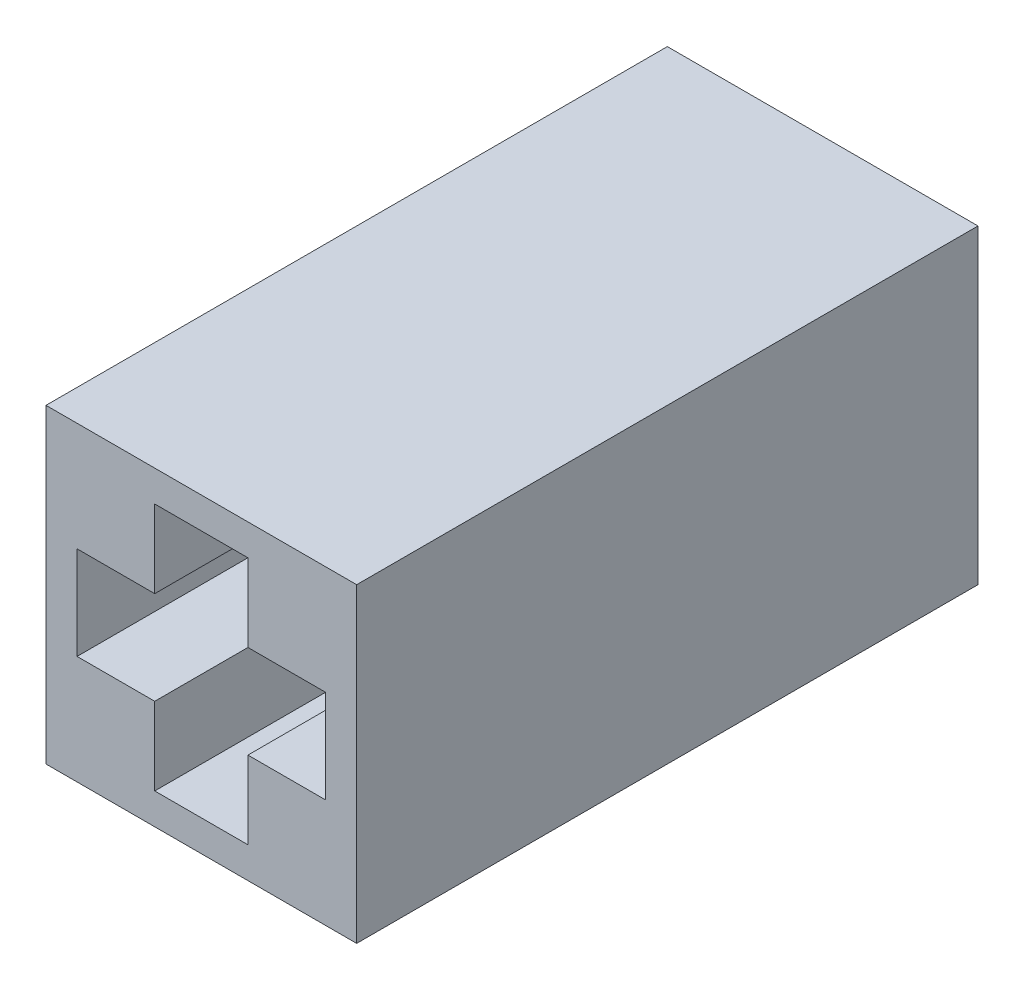
ISO-10303-21;
HEADER;
FILE_DESCRIPTION(('STEP AP214'),'2;1');
FILE_NAME('part.step','',(''),(''),'','','');
FILE_SCHEMA(('AUTOMOTIVE_DESIGN { 1 0 10303 214 1 1 1 1 }'));
ENDSEC;
DATA;
#1=APPLICATION_CONTEXT('core data for automotive mechanical design processes');
#2=APPLICATION_PROTOCOL_DEFINITION('international standard','automotive_design',2000,#1);
#3=PRODUCT_CONTEXT('',#1,'mechanical');
#4=PRODUCT('Part','Part','',(#3));
#5=PRODUCT_RELATED_PRODUCT_CATEGORY('part','',(#4));
#6=PRODUCT_DEFINITION_FORMATION('','',#4);
#7=PRODUCT_DEFINITION_CONTEXT('part definition',#1,'design');
#8=PRODUCT_DEFINITION('design','',#6,#7);
#9=PRODUCT_DEFINITION_SHAPE('','',#8);
#10=(LENGTH_UNIT() NAMED_UNIT(*) SI_UNIT(.MILLI.,.METRE.));
#11=(NAMED_UNIT(*) PLANE_ANGLE_UNIT() SI_UNIT($,.RADIAN.));
#12=(NAMED_UNIT(*) SI_UNIT($,.STERADIAN.) SOLID_ANGLE_UNIT());
#13=UNCERTAINTY_MEASURE_WITH_UNIT(LENGTH_MEASURE(1.E-05),#10,'distance_accuracy_value','');
#14=(GEOMETRIC_REPRESENTATION_CONTEXT(3) GLOBAL_UNCERTAINTY_ASSIGNED_CONTEXT((#13)) GLOBAL_UNIT_ASSIGNED_CONTEXT((#10,
#11,#12)) REPRESENTATION_CONTEXT('',''));
#15=CARTESIAN_POINT('',(0.,0.,0.));
#16=DIRECTION('',(0.,0.,1.));
#17=DIRECTION('',(1.,0.,0.));
#18=AXIS2_PLACEMENT_3D('',#15,#16,#17);
#19=CARTESIAN_POINT('',(25.,25.,-100.));
#20=DIRECTION('',(1.,0.,0.));
#21=DIRECTION('',(0.,1.,0.));
#22=AXIS2_PLACEMENT_3D('',#19,#20,#21);
#23=PLANE('',#22);
#24=DIRECTION('',(0.,1.,0.));
#25=VECTOR('',#24,1.);
#26=CARTESIAN_POINT('',(25.,25.,0.));
#27=LINE('',#26,#25);
#28=CARTESIAN_POINT('',(25.,-25.,0.));
#29=VERTEX_POINT('',#28);
#30=CARTESIAN_POINT('',(25.,25.,0.));
#31=VERTEX_POINT('',#30);
#32=EDGE_CURVE('E248',#29,#31,#27,.T.);
#33=ORIENTED_EDGE('',*,*,#32,.F.);
#34=DIRECTION('',(0.,0.,1.));
#35=VECTOR('',#34,1.);
#36=CARTESIAN_POINT('',(25.,-25.,-100.));
#37=LINE('',#36,#35);
#38=CARTESIAN_POINT('',(25.,-25.,-100.));
#39=VERTEX_POINT('',#38);
#40=EDGE_CURVE('E11',#39,#29,#37,.T.);
#41=ORIENTED_EDGE('',*,*,#40,.F.);
#42=DIRECTION('',(0.,1.,0.));
#43=VECTOR('',#42,1.);
#44=CARTESIAN_POINT('',(25.,25.,-100.));
#45=LINE('',#44,#43);
#46=CARTESIAN_POINT('',(25.,25.,-100.));
#47=VERTEX_POINT('',#46);
#48=EDGE_CURVE('E249',#39,#47,#45,.T.);
#49=ORIENTED_EDGE('',*,*,#48,.T.);
#50=DIRECTION('',(0.,0.,1.));
#51=VECTOR('',#50,1.);
#52=CARTESIAN_POINT('',(25.,25.,-100.));
#53=LINE('',#52,#51);
#54=EDGE_CURVE('E36',#47,#31,#53,.T.);
#55=ORIENTED_EDGE('',*,*,#54,.T.);
#56=EDGE_LOOP('',(#33,#41,#49,#55));
#57=FACE_BOUND('',#56,.T.);
#58=ADVANCED_FACE('F33',(#57),#23,.T.);
#59=CARTESIAN_POINT('',(-25.,-25.,-100.));
#60=DIRECTION('',(0.,-1.,0.));
#61=DIRECTION('',(0.,0.,-1.));
#62=AXIS2_PLACEMENT_3D('',#59,#60,#61);
#63=PLANE('',#62);
#64=DIRECTION('',(1.,0.,0.));
#65=VECTOR('',#64,1.);
#66=CARTESIAN_POINT('',(-25.,-25.,0.));
#67=LINE('',#66,#65);
#68=CARTESIAN_POINT('',(-25.,-25.,0.));
#69=VERTEX_POINT('',#68);
#70=EDGE_CURVE('E253',#69,#29,#67,.T.);
#71=ORIENTED_EDGE('',*,*,#70,.F.);
#72=DIRECTION('',(0.,0.,1.));
#73=VECTOR('',#72,1.);
#74=CARTESIAN_POINT('',(-25.,-25.,-100.));
#75=LINE('',#74,#73);
#76=CARTESIAN_POINT('',(-25.,-25.,-100.));
#77=VERTEX_POINT('',#76);
#78=EDGE_CURVE('E41',#77,#69,#75,.T.);
#79=ORIENTED_EDGE('',*,*,#78,.F.);
#80=DIRECTION('',(1.,0.,0.));
#81=VECTOR('',#80,1.);
#82=CARTESIAN_POINT('',(-25.,-25.,-100.));
#83=LINE('',#82,#81);
#84=EDGE_CURVE('E259',#77,#39,#83,.T.);
#85=ORIENTED_EDGE('',*,*,#84,.T.);
#86=ORIENTED_EDGE('',*,*,#40,.T.);
#87=EDGE_LOOP('',(#71,#79,#85,#86));
#88=FACE_BOUND('',#87,.T.);
#89=ADVANCED_FACE('F283',(#88),#63,.T.);
#90=CARTESIAN_POINT('',(-25.,25.,-100.));
#91=DIRECTION('',(-1.,0.,0.));
#92=DIRECTION('',(0.,-1.,0.));
#93=AXIS2_PLACEMENT_3D('',#90,#91,#92);
#94=PLANE('',#93);
#95=DIRECTION('',(0.,-1.,0.));
#96=VECTOR('',#95,1.);
#97=CARTESIAN_POINT('',(-25.,25.,0.));
#98=LINE('',#97,#96);
#99=CARTESIAN_POINT('',(-25.,25.,0.));
#100=VERTEX_POINT('',#99);
#101=EDGE_CURVE('E267',#100,#69,#98,.T.);
#102=ORIENTED_EDGE('',*,*,#101,.F.);
#103=DIRECTION('',(0.,0.,1.));
#104=VECTOR('',#103,1.);
#105=CARTESIAN_POINT('',(-25.,25.,-100.));
#106=LINE('',#105,#104);
#107=CARTESIAN_POINT('',(-25.,25.,-100.));
#108=VERTEX_POINT('',#107);
#109=EDGE_CURVE('E272',#108,#100,#106,.T.);
#110=ORIENTED_EDGE('',*,*,#109,.F.);
#111=DIRECTION('',(0.,-1.,0.));
#112=VECTOR('',#111,1.);
#113=CARTESIAN_POINT('',(-25.,25.,-100.));
#114=LINE('',#113,#112);
#115=EDGE_CURVE('E256',#108,#77,#114,.T.);
#116=ORIENTED_EDGE('',*,*,#115,.T.);
#117=ORIENTED_EDGE('',*,*,#78,.T.);
#118=EDGE_LOOP('',(#102,#110,#116,#117));
#119=FACE_BOUND('',#118,.T.);
#120=ADVANCED_FACE('F289',(#119),#94,.T.);
#121=CARTESIAN_POINT('',(-25.,25.,-100.));
#122=DIRECTION('',(0.,1.,0.));
#123=DIRECTION('',(0.,0.,1.));
#124=AXIS2_PLACEMENT_3D('',#121,#122,#123);
#125=PLANE('',#124);
#126=DIRECTION('',(-1.,0.,0.));
#127=VECTOR('',#126,1.);
#128=CARTESIAN_POINT('',(-25.,25.,0.));
#129=LINE('',#128,#127);
#130=EDGE_CURVE('E264',#31,#100,#129,.T.);
#131=ORIENTED_EDGE('',*,*,#130,.F.);
#132=ORIENTED_EDGE('',*,*,#54,.F.);
#133=DIRECTION('',(-1.,0.,0.));
#134=VECTOR('',#133,1.);
#135=CARTESIAN_POINT('',(-25.,25.,-100.));
#136=LINE('',#135,#134);
#137=EDGE_CURVE('E252',#47,#108,#136,.T.);
#138=ORIENTED_EDGE('',*,*,#137,.T.);
#139=ORIENTED_EDGE('',*,*,#109,.T.);
#140=EDGE_LOOP('',(#131,#132,#138,#139));
#141=FACE_BOUND('',#140,.T.);
#142=ADVANCED_FACE('F280',(#141),#125,.T.);
#143=CARTESIAN_POINT('',(0.,0.,-100.));
#144=DIRECTION('',(0.,0.,1.));
#145=DIRECTION('',(1.,0.,0.));
#146=AXIS2_PLACEMENT_3D('',#143,#144,#145);
#147=PLANE('',#146);
#148=DIRECTION('',(1.,0.,0.));
#149=VECTOR('',#148,1.);
#150=CARTESIAN_POINT('',(0.,-20.,-100.));
#151=LINE('',#150,#149);
#152=CARTESIAN_POINT('',(-7.5,-20.,-100.));
#153=VERTEX_POINT('',#152);
#154=CARTESIAN_POINT('',(7.5,-20.,-100.));
#155=VERTEX_POINT('',#154);
#156=EDGE_CURVE('E242',#153,#155,#151,.T.);
#157=ORIENTED_EDGE('',*,*,#156,.T.);
#158=DIRECTION('',(0.,1.,0.));
#159=VECTOR('',#158,1.);
#160=CARTESIAN_POINT('',(7.5,0.,-100.));
#161=LINE('',#160,#159);
#162=CARTESIAN_POINT('',(7.5,-7.5,-100.));
#163=VERTEX_POINT('',#162);
#164=EDGE_CURVE('E245',#155,#163,#161,.T.);
#165=ORIENTED_EDGE('',*,*,#164,.T.);
#166=DIRECTION('',(1.,0.,0.));
#167=VECTOR('',#166,1.);
#168=CARTESIAN_POINT('',(0.,-7.5,-100.));
#169=LINE('',#168,#167);
#170=CARTESIAN_POINT('',(20.,-7.5,-100.));
#171=VERTEX_POINT('',#170);
#172=EDGE_CURVE('E197',#163,#171,#169,.T.);
#173=ORIENTED_EDGE('',*,*,#172,.T.);
#174=DIRECTION('',(0.,1.,0.));
#175=VECTOR('',#174,1.);
#176=CARTESIAN_POINT('',(20.,0.,-100.));
#177=LINE('',#176,#175);
#178=CARTESIAN_POINT('',(20.,7.5,-100.));
#179=VERTEX_POINT('',#178);
#180=EDGE_CURVE('E152',#171,#179,#177,.T.);
#181=ORIENTED_EDGE('',*,*,#180,.T.);
#182=DIRECTION('',(-1.,0.,0.));
#183=VECTOR('',#182,1.);
#184=CARTESIAN_POINT('',(0.,7.5,-100.));
#185=LINE('',#184,#183);
#186=CARTESIAN_POINT('',(7.5,7.5,-100.));
#187=VERTEX_POINT('',#186);
#188=EDGE_CURVE('E218',#179,#187,#185,.T.);
#189=ORIENTED_EDGE('',*,*,#188,.T.);
#190=DIRECTION('',(0.,1.,0.));
#191=VECTOR('',#190,1.);
#192=CARTESIAN_POINT('',(7.5,0.,-100.));
#193=LINE('',#192,#191);
#194=CARTESIAN_POINT('',(7.5,20.,-100.));
#195=VERTEX_POINT('',#194);
#196=EDGE_CURVE('E221',#187,#195,#193,.T.);
#197=ORIENTED_EDGE('',*,*,#196,.T.);
#198=DIRECTION('',(-1.,0.,0.));
#199=VECTOR('',#198,1.);
#200=CARTESIAN_POINT('',(0.,20.,-100.));
#201=LINE('',#200,#199);
#202=CARTESIAN_POINT('',(-7.5,20.,-100.));
#203=VERTEX_POINT('',#202);
#204=EDGE_CURVE('E224',#195,#203,#201,.T.);
#205=ORIENTED_EDGE('',*,*,#204,.T.);
#206=DIRECTION('',(0.,-1.,0.));
#207=VECTOR('',#206,1.);
#208=CARTESIAN_POINT('',(-7.5,0.,-100.));
#209=LINE('',#208,#207);
#210=CARTESIAN_POINT('',(-7.5,7.5,-100.));
#211=VERTEX_POINT('',#210);
#212=EDGE_CURVE('E227',#203,#211,#209,.T.);
#213=ORIENTED_EDGE('',*,*,#212,.T.);
#214=DIRECTION('',(-1.,0.,0.));
#215=VECTOR('',#214,1.);
#216=CARTESIAN_POINT('',(0.,7.5,-100.));
#217=LINE('',#216,#215);
#218=CARTESIAN_POINT('',(-20.,7.5,-100.));
#219=VERTEX_POINT('',#218);
#220=EDGE_CURVE('E230',#211,#219,#217,.T.);
#221=ORIENTED_EDGE('',*,*,#220,.T.);
#222=DIRECTION('',(0.,-1.,0.));
#223=VECTOR('',#222,1.);
#224=CARTESIAN_POINT('',(-20.,0.,-100.));
#225=LINE('',#224,#223);
#226=CARTESIAN_POINT('',(-20.,-7.5,-100.));
#227=VERTEX_POINT('',#226);
#228=EDGE_CURVE('E233',#219,#227,#225,.T.);
#229=ORIENTED_EDGE('',*,*,#228,.T.);
#230=DIRECTION('',(1.,0.,0.));
#231=VECTOR('',#230,1.);
#232=CARTESIAN_POINT('',(0.,-7.5,-100.));
#233=LINE('',#232,#231);
#234=CARTESIAN_POINT('',(-7.5,-7.5,-100.));
#235=VERTEX_POINT('',#234);
#236=EDGE_CURVE('E236',#227,#235,#233,.T.);
#237=ORIENTED_EDGE('',*,*,#236,.T.);
#238=DIRECTION('',(0.,-1.,0.));
#239=VECTOR('',#238,1.);
#240=CARTESIAN_POINT('',(-7.5,0.,-100.));
#241=LINE('',#240,#239);
#242=EDGE_CURVE('E239',#235,#153,#241,.T.);
#243=ORIENTED_EDGE('',*,*,#242,.T.);
#244=EDGE_LOOP('',(#157,#165,#173,#181,#189,#197,#205,#213,#221,#229,#237,#243));
#245=FACE_BOUND('',#244,.T.);
#246=ORIENTED_EDGE('',*,*,#48,.F.);
#247=ORIENTED_EDGE('',*,*,#84,.F.);
#248=ORIENTED_EDGE('',*,*,#115,.F.);
#249=ORIENTED_EDGE('',*,*,#137,.F.);
#250=EDGE_LOOP('',(#246,#247,#248,#249));
#251=FACE_BOUND('',#250,.T.);
#252=ADVANCED_FACE('F286',(#245,#251),#147,.F.);
#253=CARTESIAN_POINT('',(0.,0.,0.));
#254=DIRECTION('',(0.,0.,1.));
#255=DIRECTION('',(1.,0.,0.));
#256=AXIS2_PLACEMENT_3D('',#253,#254,#255);
#257=PLANE('',#256);
#258=DIRECTION('',(0.,1.,0.));
#259=VECTOR('',#258,1.);
#260=CARTESIAN_POINT('',(7.5,-7.5,0.));
#261=LINE('',#260,#259);
#262=CARTESIAN_POINT('',(7.5,-20.,0.));
#263=VERTEX_POINT('',#262);
#264=CARTESIAN_POINT('',(7.5,-7.5,0.));
#265=VERTEX_POINT('',#264);
#266=EDGE_CURVE('E57',#263,#265,#261,.T.);
#267=ORIENTED_EDGE('',*,*,#266,.F.);
#268=DIRECTION('',(1.,0.,0.));
#269=VECTOR('',#268,1.);
#270=CARTESIAN_POINT('',(-7.5,-20.,0.));
#271=LINE('',#270,#269);
#272=CARTESIAN_POINT('',(-7.5,-20.,0.));
#273=VERTEX_POINT('',#272);
#274=EDGE_CURVE('E192',#273,#263,#271,.T.);
#275=ORIENTED_EDGE('',*,*,#274,.F.);
#276=DIRECTION('',(0.,-1.,0.));
#277=VECTOR('',#276,1.);
#278=CARTESIAN_POINT('',(-7.5,-7.5,0.));
#279=LINE('',#278,#277);
#280=CARTESIAN_POINT('',(-7.5,-7.5,0.));
#281=VERTEX_POINT('',#280);
#282=EDGE_CURVE('E189',#281,#273,#279,.T.);
#283=ORIENTED_EDGE('',*,*,#282,.F.);
#284=DIRECTION('',(1.,0.,0.));
#285=VECTOR('',#284,1.);
#286=CARTESIAN_POINT('',(-20.,-7.5,0.));
#287=LINE('',#286,#285);
#288=CARTESIAN_POINT('',(-20.,-7.5,0.));
#289=VERTEX_POINT('',#288);
#290=EDGE_CURVE('E186',#289,#281,#287,.T.);
#291=ORIENTED_EDGE('',*,*,#290,.F.);
#292=DIRECTION('',(0.,-1.,0.));
#293=VECTOR('',#292,1.);
#294=CARTESIAN_POINT('',(-20.,7.5,0.));
#295=LINE('',#294,#293);
#296=CARTESIAN_POINT('',(-20.,7.5,0.));
#297=VERTEX_POINT('',#296);
#298=EDGE_CURVE('E183',#297,#289,#295,.T.);
#299=ORIENTED_EDGE('',*,*,#298,.F.);
#300=DIRECTION('',(-1.,0.,0.));
#301=VECTOR('',#300,1.);
#302=CARTESIAN_POINT('',(-20.,7.5,0.));
#303=LINE('',#302,#301);
#304=CARTESIAN_POINT('',(-7.5,7.5,0.));
#305=VERTEX_POINT('',#304);
#306=EDGE_CURVE('E180',#305,#297,#303,.T.);
#307=ORIENTED_EDGE('',*,*,#306,.F.);
#308=DIRECTION('',(0.,-1.,0.));
#309=VECTOR('',#308,1.);
#310=CARTESIAN_POINT('',(-7.5,20.,0.));
#311=LINE('',#310,#309);
#312=CARTESIAN_POINT('',(-7.5,20.,0.));
#313=VERTEX_POINT('',#312);
#314=EDGE_CURVE('E177',#313,#305,#311,.T.);
#315=ORIENTED_EDGE('',*,*,#314,.F.);
#316=DIRECTION('',(-1.,0.,0.));
#317=VECTOR('',#316,1.);
#318=CARTESIAN_POINT('',(-7.5,20.,0.));
#319=LINE('',#318,#317);
#320=CARTESIAN_POINT('',(7.5,20.,0.));
#321=VERTEX_POINT('',#320);
#322=EDGE_CURVE('E174',#321,#313,#319,.T.);
#323=ORIENTED_EDGE('',*,*,#322,.F.);
#324=DIRECTION('',(0.,1.,0.));
#325=VECTOR('',#324,1.);
#326=CARTESIAN_POINT('',(7.5,20.,0.));
#327=LINE('',#326,#325);
#328=CARTESIAN_POINT('',(7.5,7.5,0.));
#329=VERTEX_POINT('',#328);
#330=EDGE_CURVE('E168',#329,#321,#327,.T.);
#331=ORIENTED_EDGE('',*,*,#330,.F.);
#332=DIRECTION('',(-1.,0.,0.));
#333=VECTOR('',#332,1.);
#334=CARTESIAN_POINT('',(7.5,7.5,0.));
#335=LINE('',#334,#333);
#336=CARTESIAN_POINT('',(20.,7.5,0.));
#337=VERTEX_POINT('',#336);
#338=EDGE_CURVE('E166',#337,#329,#335,.T.);
#339=ORIENTED_EDGE('',*,*,#338,.F.);
#340=DIRECTION('',(0.,1.,0.));
#341=VECTOR('',#340,1.);
#342=CARTESIAN_POINT('',(20.,7.5,0.));
#343=LINE('',#342,#341);
#344=CARTESIAN_POINT('',(20.,-7.5,0.));
#345=VERTEX_POINT('',#344);
#346=EDGE_CURVE('E149',#345,#337,#343,.T.);
#347=ORIENTED_EDGE('',*,*,#346,.F.);
#348=DIRECTION('',(1.,0.,0.));
#349=VECTOR('',#348,1.);
#350=CARTESIAN_POINT('',(7.5,-7.5,0.));
#351=LINE('',#350,#349);
#352=EDGE_CURVE('E158',#265,#345,#351,.T.);
#353=ORIENTED_EDGE('',*,*,#352,.F.);
#354=EDGE_LOOP('',(#267,#275,#283,#291,#299,#307,#315,#323,#331,#339,#347,#353));
#355=FACE_BOUND('',#354,.T.);
#356=ORIENTED_EDGE('',*,*,#32,.T.);
#357=ORIENTED_EDGE('',*,*,#130,.T.);
#358=ORIENTED_EDGE('',*,*,#101,.T.);
#359=ORIENTED_EDGE('',*,*,#70,.T.);
#360=EDGE_LOOP('',(#356,#357,#358,#359));
#361=FACE_BOUND('',#360,.T.);
#362=ADVANCED_FACE('F162',(#355,#361),#257,.T.);
#363=CARTESIAN_POINT('',(7.5,-7.5,-400.));
#364=DIRECTION('',(1.,0.,0.));
#365=DIRECTION('',(0.,1.,0.));
#366=AXIS2_PLACEMENT_3D('',#363,#364,#365);
#367=PLANE('',#366);
#368=DIRECTION('',(0.,0.,1.));
#369=VECTOR('',#368,1.);
#370=CARTESIAN_POINT('',(7.5,-20.,-400.));
#371=LINE('',#370,#369);
#372=EDGE_CURVE('E195',#155,#263,#371,.T.);
#373=ORIENTED_EDGE('',*,*,#372,.T.);
#374=ORIENTED_EDGE('',*,*,#266,.T.);
#375=DIRECTION('',(0.,0.,1.));
#376=VECTOR('',#375,1.);
#377=CARTESIAN_POINT('',(7.5,-7.5,-400.));
#378=LINE('',#377,#376);
#379=EDGE_CURVE('E155',#163,#265,#378,.T.);
#380=ORIENTED_EDGE('',*,*,#379,.F.);
#381=ORIENTED_EDGE('',*,*,#164,.F.);
#382=EDGE_LOOP('',(#373,#374,#380,#381));
#383=FACE_BOUND('',#382,.T.);
#384=ADVANCED_FACE('F332',(#383),#367,.F.);
#385=CARTESIAN_POINT('',(-7.5,-20.,-400.));
#386=DIRECTION('',(0.,-1.,0.));
#387=DIRECTION('',(0.,0.,-1.));
#388=AXIS2_PLACEMENT_3D('',#385,#386,#387);
#389=PLANE('',#388);
#390=DIRECTION('',(0.,0.,1.));
#391=VECTOR('',#390,1.);
#392=CARTESIAN_POINT('',(-7.5,-20.,-400.));
#393=LINE('',#392,#391);
#394=EDGE_CURVE('E198',#153,#273,#393,.T.);
#395=ORIENTED_EDGE('',*,*,#394,.T.);
#396=ORIENTED_EDGE('',*,*,#274,.T.);
#397=ORIENTED_EDGE('',*,*,#372,.F.);
#398=ORIENTED_EDGE('',*,*,#156,.F.);
#399=EDGE_LOOP('',(#395,#396,#397,#398));
#400=FACE_BOUND('',#399,.T.);
#401=ADVANCED_FACE('F341',(#400),#389,.F.);
#402=CARTESIAN_POINT('',(-7.5,-7.5,-400.));
#403=DIRECTION('',(-1.,0.,0.));
#404=DIRECTION('',(0.,0.,1.));
#405=AXIS2_PLACEMENT_3D('',#402,#403,#404);
#406=PLANE('',#405);
#407=DIRECTION('',(0.,0.,1.));
#408=VECTOR('',#407,1.);
#409=CARTESIAN_POINT('',(-7.5,-7.5,-400.));
#410=LINE('',#409,#408);
#411=EDGE_CURVE('E200',#235,#281,#410,.T.);
#412=ORIENTED_EDGE('',*,*,#411,.T.);
#413=ORIENTED_EDGE('',*,*,#282,.T.);
#414=ORIENTED_EDGE('',*,*,#394,.F.);
#415=ORIENTED_EDGE('',*,*,#242,.F.);
#416=EDGE_LOOP('',(#412,#413,#414,#415));
#417=FACE_BOUND('',#416,.T.);
#418=ADVANCED_FACE('F350',(#417),#406,.F.);
#419=CARTESIAN_POINT('',(-20.,-7.5,-400.));
#420=DIRECTION('',(0.,-1.,0.));
#421=DIRECTION('',(1.,0.,0.));
#422=AXIS2_PLACEMENT_3D('',#419,#420,#421);
#423=PLANE('',#422);
#424=DIRECTION('',(0.,0.,1.));
#425=VECTOR('',#424,1.);
#426=CARTESIAN_POINT('',(-20.,-7.5,-400.));
#427=LINE('',#426,#425);
#428=EDGE_CURVE('E202',#227,#289,#427,.T.);
#429=ORIENTED_EDGE('',*,*,#428,.T.);
#430=ORIENTED_EDGE('',*,*,#290,.T.);
#431=ORIENTED_EDGE('',*,*,#411,.F.);
#432=ORIENTED_EDGE('',*,*,#236,.F.);
#433=EDGE_LOOP('',(#429,#430,#431,#432));
#434=FACE_BOUND('',#433,.T.);
#435=ADVANCED_FACE('F360',(#434),#423,.F.);
#436=CARTESIAN_POINT('',(-20.,7.5,-400.));
#437=DIRECTION('',(-1.,0.,0.));
#438=DIRECTION('',(0.,-1.,0.));
#439=AXIS2_PLACEMENT_3D('',#436,#437,#438);
#440=PLANE('',#439);
#441=DIRECTION('',(0.,0.,1.));
#442=VECTOR('',#441,1.);
#443=CARTESIAN_POINT('',(-20.,7.5,-400.));
#444=LINE('',#443,#442);
#445=EDGE_CURVE('E204',#219,#297,#444,.T.);
#446=ORIENTED_EDGE('',*,*,#445,.T.);
#447=ORIENTED_EDGE('',*,*,#298,.T.);
#448=ORIENTED_EDGE('',*,*,#428,.F.);
#449=ORIENTED_EDGE('',*,*,#228,.F.);
#450=EDGE_LOOP('',(#446,#447,#448,#449));
#451=FACE_BOUND('',#450,.T.);
#452=ADVANCED_FACE('F370',(#451),#440,.F.);
#453=CARTESIAN_POINT('',(-20.,7.5,-400.));
#454=DIRECTION('',(0.,1.,0.));
#455=DIRECTION('',(-1.,0.,0.));
#456=AXIS2_PLACEMENT_3D('',#453,#454,#455);
#457=PLANE('',#456);
#458=DIRECTION('',(0.,0.,1.));
#459=VECTOR('',#458,1.);
#460=CARTESIAN_POINT('',(-7.5,7.5,-400.));
#461=LINE('',#460,#459);
#462=EDGE_CURVE('E206',#211,#305,#461,.T.);
#463=ORIENTED_EDGE('',*,*,#462,.T.);
#464=ORIENTED_EDGE('',*,*,#306,.T.);
#465=ORIENTED_EDGE('',*,*,#445,.F.);
#466=ORIENTED_EDGE('',*,*,#220,.F.);
#467=EDGE_LOOP('',(#463,#464,#465,#466));
#468=FACE_BOUND('',#467,.T.);
#469=ADVANCED_FACE('F380',(#468),#457,.F.);
#470=CARTESIAN_POINT('',(-7.5,20.,-400.));
#471=DIRECTION('',(-1.,0.,0.));
#472=DIRECTION('',(0.,-1.,0.));
#473=AXIS2_PLACEMENT_3D('',#470,#471,#472);
#474=PLANE('',#473);
#475=DIRECTION('',(0.,0.,1.));
#476=VECTOR('',#475,1.);
#477=CARTESIAN_POINT('',(-7.5,20.,-400.));
#478=LINE('',#477,#476);
#479=EDGE_CURVE('E208',#203,#313,#478,.T.);
#480=ORIENTED_EDGE('',*,*,#479,.T.);
#481=ORIENTED_EDGE('',*,*,#314,.T.);
#482=ORIENTED_EDGE('',*,*,#462,.F.);
#483=ORIENTED_EDGE('',*,*,#212,.F.);
#484=EDGE_LOOP('',(#480,#481,#482,#483));
#485=FACE_BOUND('',#484,.T.);
#486=ADVANCED_FACE('F390',(#485),#474,.F.);
#487=CARTESIAN_POINT('',(-7.5,20.,-400.));
#488=DIRECTION('',(0.,1.,0.));
#489=DIRECTION('',(0.,0.,1.));
#490=AXIS2_PLACEMENT_3D('',#487,#488,#489);
#491=PLANE('',#490);
#492=DIRECTION('',(0.,0.,1.));
#493=VECTOR('',#492,1.);
#494=CARTESIAN_POINT('',(7.5,20.,-400.));
#495=LINE('',#494,#493);
#496=EDGE_CURVE('E210',#195,#321,#495,.T.);
#497=ORIENTED_EDGE('',*,*,#496,.T.);
#498=ORIENTED_EDGE('',*,*,#322,.T.);
#499=ORIENTED_EDGE('',*,*,#479,.F.);
#500=ORIENTED_EDGE('',*,*,#204,.F.);
#501=EDGE_LOOP('',(#497,#498,#499,#500));
#502=FACE_BOUND('',#501,.T.);
#503=ADVANCED_FACE('F400',(#502),#491,.F.);
#504=CARTESIAN_POINT('',(7.5,20.,-400.));
#505=DIRECTION('',(1.,0.,0.));
#506=DIRECTION('',(0.,1.,0.));
#507=AXIS2_PLACEMENT_3D('',#504,#505,#506);
#508=PLANE('',#507);
#509=DIRECTION('',(0.,0.,1.));
#510=VECTOR('',#509,1.);
#511=CARTESIAN_POINT('',(7.5,7.5,-400.));
#512=LINE('',#511,#510);
#513=EDGE_CURVE('E212',#187,#329,#512,.T.);
#514=ORIENTED_EDGE('',*,*,#513,.T.);
#515=ORIENTED_EDGE('',*,*,#330,.T.);
#516=ORIENTED_EDGE('',*,*,#496,.F.);
#517=ORIENTED_EDGE('',*,*,#196,.F.);
#518=EDGE_LOOP('',(#514,#515,#516,#517));
#519=FACE_BOUND('',#518,.T.);
#520=ADVANCED_FACE('F410',(#519),#508,.F.);
#521=CARTESIAN_POINT('',(7.5,7.5,-400.));
#522=DIRECTION('',(0.,1.,0.));
#523=DIRECTION('',(-1.,0.,0.));
#524=AXIS2_PLACEMENT_3D('',#521,#522,#523);
#525=PLANE('',#524);
#526=DIRECTION('',(0.,0.,1.));
#527=VECTOR('',#526,1.);
#528=CARTESIAN_POINT('',(20.,7.5,-400.));
#529=LINE('',#528,#527);
#530=EDGE_CURVE('E154',#179,#337,#529,.T.);
#531=ORIENTED_EDGE('',*,*,#530,.T.);
#532=ORIENTED_EDGE('',*,*,#338,.T.);
#533=ORIENTED_EDGE('',*,*,#513,.F.);
#534=ORIENTED_EDGE('',*,*,#188,.F.);
#535=EDGE_LOOP('',(#531,#532,#533,#534));
#536=FACE_BOUND('',#535,.T.);
#537=ADVANCED_FACE('F420',(#536),#525,.F.);
#538=CARTESIAN_POINT('',(20.,7.5,-400.));
#539=DIRECTION('',(1.,0.,0.));
#540=DIRECTION('',(0.,1.,0.));
#541=AXIS2_PLACEMENT_3D('',#538,#539,#540);
#542=PLANE('',#541);
#543=DIRECTION('',(0.,0.,1.));
#544=VECTOR('',#543,1.);
#545=CARTESIAN_POINT('',(20.,-7.5,-400.));
#546=LINE('',#545,#544);
#547=EDGE_CURVE('E49',#171,#345,#546,.T.);
#548=ORIENTED_EDGE('',*,*,#547,.T.);
#549=ORIENTED_EDGE('',*,*,#346,.T.);
#550=ORIENTED_EDGE('',*,*,#530,.F.);
#551=ORIENTED_EDGE('',*,*,#180,.F.);
#552=EDGE_LOOP('',(#548,#549,#550,#551));
#553=FACE_BOUND('',#552,.T.);
#554=ADVANCED_FACE('F146',(#553),#542,.F.);
#555=CARTESIAN_POINT('',(7.5,-7.5,-400.));
#556=DIRECTION('',(0.,-1.,0.));
#557=DIRECTION('',(1.,0.,0.));
#558=AXIS2_PLACEMENT_3D('',#555,#556,#557);
#559=PLANE('',#558);
#560=ORIENTED_EDGE('',*,*,#379,.T.);
#561=ORIENTED_EDGE('',*,*,#352,.T.);
#562=ORIENTED_EDGE('',*,*,#547,.F.);
#563=ORIENTED_EDGE('',*,*,#172,.F.);
#564=EDGE_LOOP('',(#560,#561,#562,#563));
#565=FACE_BOUND('',#564,.T.);
#566=ADVANCED_FACE('F159',(#565),#559,.F.);
#567=CLOSED_SHELL('',(#58,#89,#120,#142,#252,#362,#384,#401,#418,#435,#452,#469,#486,#503,#520,
#537,#554,#566));
#568=MANIFOLD_SOLID_BREP('B2',#567);
#569=ADVANCED_BREP_SHAPE_REPRESENTATION('',(#18,#568),#14);
#570=SHAPE_DEFINITION_REPRESENTATION(#9,#569);
ENDSEC;
END-ISO-10303-21;
